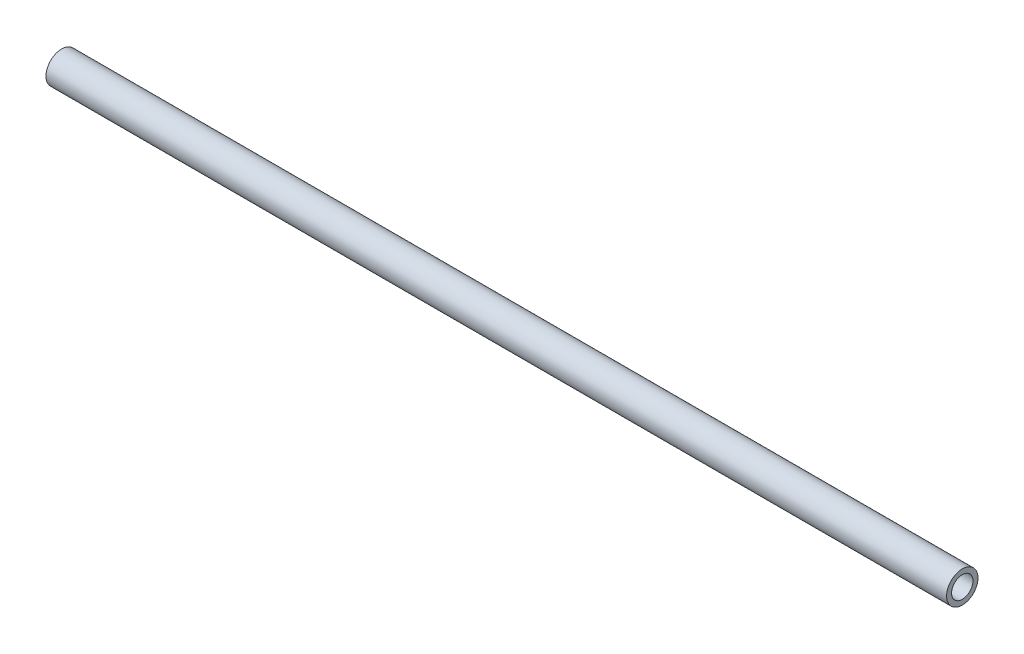
ISO-10303-21;
HEADER;
FILE_DESCRIPTION(('STEP AP214'),'2;1');
FILE_NAME('part.step','',(''),(''),'','','');
FILE_SCHEMA(('AUTOMOTIVE_DESIGN { 1 0 10303 214 1 1 1 1 }'));
ENDSEC;
DATA;
#1=APPLICATION_CONTEXT('core data for automotive mechanical design processes');
#2=APPLICATION_PROTOCOL_DEFINITION('international standard','automotive_design',2000,#1);
#3=PRODUCT_CONTEXT('',#1,'mechanical');
#4=PRODUCT('Part','Part','',(#3));
#5=PRODUCT_RELATED_PRODUCT_CATEGORY('part','',(#4));
#6=PRODUCT_DEFINITION_FORMATION('','',#4);
#7=PRODUCT_DEFINITION_CONTEXT('part definition',#1,'design');
#8=PRODUCT_DEFINITION('design','',#6,#7);
#9=PRODUCT_DEFINITION_SHAPE('','',#8);
#10=(LENGTH_UNIT() NAMED_UNIT(*) SI_UNIT(.MILLI.,.METRE.));
#11=(NAMED_UNIT(*) PLANE_ANGLE_UNIT() SI_UNIT($,.RADIAN.));
#12=(NAMED_UNIT(*) SI_UNIT($,.STERADIAN.) SOLID_ANGLE_UNIT());
#13=UNCERTAINTY_MEASURE_WITH_UNIT(LENGTH_MEASURE(1.E-05),#10,'distance_accuracy_value','');
#14=(GEOMETRIC_REPRESENTATION_CONTEXT(3) GLOBAL_UNCERTAINTY_ASSIGNED_CONTEXT((#13)) GLOBAL_UNIT_ASSIGNED_CONTEXT((#10,
#11,#12)) REPRESENTATION_CONTEXT('',''));
#15=CARTESIAN_POINT('',(0.,0.,0.));
#16=DIRECTION('',(0.,0.,1.));
#17=DIRECTION('',(1.,0.,0.));
#18=AXIS2_PLACEMENT_3D('',#15,#16,#17);
#19=CARTESIAN_POINT('',(-273.05,0.,0.));
#20=DIRECTION('',(1.,0.,0.));
#21=DIRECTION('',(0.,0.,-1.));
#22=AXIS2_PLACEMENT_3D('',#19,#20,#21);
#23=CYLINDRICAL_SURFACE('',#22,6.477);
#24=CARTESIAN_POINT('',(273.05,0.,0.));
#25=DIRECTION('',(1.,0.,0.));
#26=DIRECTION('',(0.,0.,-1.));
#27=AXIS2_PLACEMENT_3D('',#24,#25,#26);
#28=CIRCLE('',#27,6.477);
#29=CARTESIAN_POINT('',(273.05,0.,-6.477));
#30=VERTEX_POINT('',#29);
#31=EDGE_CURVE('E18',#30,#30,#28,.F.);
#32=ORIENTED_EDGE('',*,*,#31,.F.);
#33=EDGE_LOOP('',(#32));
#34=FACE_BOUND('',#33,.T.);
#35=CARTESIAN_POINT('',(-273.05,0.,0.));
#36=DIRECTION('',(1.,0.,0.));
#37=DIRECTION('',(0.,0.,-1.));
#38=AXIS2_PLACEMENT_3D('',#35,#36,#37);
#39=CIRCLE('',#38,6.477);
#40=CARTESIAN_POINT('',(-273.05,0.,-6.477));
#41=VERTEX_POINT('',#40);
#42=EDGE_CURVE('E27',#41,#41,#39,.F.);
#43=ORIENTED_EDGE('',*,*,#42,.T.);
#44=EDGE_LOOP('',(#43));
#45=FACE_BOUND('',#44,.T.);
#46=ADVANCED_FACE('F15',(#34,#45),#23,.F.);
#47=CARTESIAN_POINT('',(273.05,0.,0.));
#48=DIRECTION('',(1.,0.,0.));
#49=DIRECTION('',(0.,0.,-1.));
#50=AXIS2_PLACEMENT_3D('',#47,#48,#49);
#51=PLANE('',#50);
#52=ORIENTED_EDGE('',*,*,#31,.T.);
#53=EDGE_LOOP('',(#52));
#54=FACE_BOUND('',#53,.T.);
#55=CARTESIAN_POINT('',(273.05,0.,0.));
#56=DIRECTION('',(1.,0.,0.));
#57=DIRECTION('',(0.,0.,-1.));
#58=AXIS2_PLACEMENT_3D('',#55,#56,#57);
#59=CIRCLE('',#58,9.525);
#60=CARTESIAN_POINT('',(273.05,0.,-9.525));
#61=VERTEX_POINT('',#60);
#62=EDGE_CURVE('E22',#61,#61,#59,.F.);
#63=ORIENTED_EDGE('',*,*,#62,.F.);
#64=EDGE_LOOP('',(#63));
#65=FACE_BOUND('',#64,.T.);
#66=ADVANCED_FACE('F35',(#54,#65),#51,.T.);
#67=CARTESIAN_POINT('',(-273.05,0.,0.));
#68=DIRECTION('',(1.,0.,0.));
#69=DIRECTION('',(0.,0.,-1.));
#70=AXIS2_PLACEMENT_3D('',#67,#68,#69);
#71=PLANE('',#70);
#72=ORIENTED_EDGE('',*,*,#42,.F.);
#73=EDGE_LOOP('',(#72));
#74=FACE_BOUND('',#73,.T.);
#75=CARTESIAN_POINT('',(-273.05,0.,0.));
#76=DIRECTION('',(1.,0.,0.));
#77=DIRECTION('',(0.,0.,-1.));
#78=AXIS2_PLACEMENT_3D('',#75,#76,#77);
#79=CIRCLE('',#78,9.525);
#80=CARTESIAN_POINT('',(-273.05,0.,-9.525));
#81=VERTEX_POINT('',#80);
#82=EDGE_CURVE('E10',#81,#81,#79,.T.);
#83=ORIENTED_EDGE('',*,*,#82,.F.);
#84=EDGE_LOOP('',(#83));
#85=FACE_BOUND('',#84,.T.);
#86=ADVANCED_FACE('F43',(#74,#85),#71,.F.);
#87=CARTESIAN_POINT('',(-273.05,0.,0.));
#88=DIRECTION('',(1.,0.,0.));
#89=DIRECTION('',(0.,0.,-1.));
#90=AXIS2_PLACEMENT_3D('',#87,#88,#89);
#91=CYLINDRICAL_SURFACE('',#90,9.525);
#92=ORIENTED_EDGE('',*,*,#62,.T.);
#93=EDGE_LOOP('',(#92));
#94=FACE_BOUND('',#93,.T.);
#95=ORIENTED_EDGE('',*,*,#82,.T.);
#96=EDGE_LOOP('',(#95));
#97=FACE_BOUND('',#96,.T.);
#98=ADVANCED_FACE('F44',(#94,#97),#91,.T.);
#99=CLOSED_SHELL('',(#46,#66,#86,#98));
#100=MANIFOLD_SOLID_BREP('B1',#99);
#101=ADVANCED_BREP_SHAPE_REPRESENTATION('',(#18,#100),#14);
#102=SHAPE_DEFINITION_REPRESENTATION(#9,#101);
ENDSEC;
END-ISO-10303-21;
